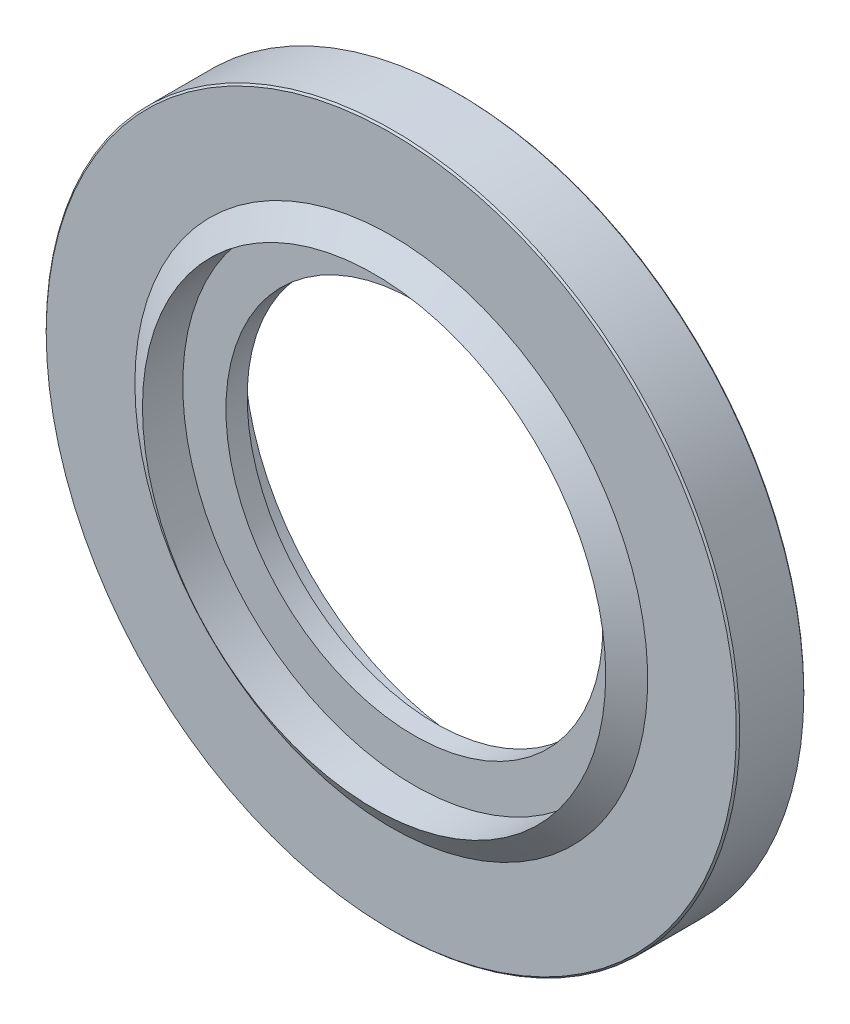
ISO-10303-21;
HEADER;
FILE_DESCRIPTION(('STEP AP214'),'2;1');
FILE_NAME('part.step','',(''),(''),'','','');
FILE_SCHEMA(('AUTOMOTIVE_DESIGN { 1 0 10303 214 1 1 1 1 }'));
ENDSEC;
DATA;
#1=APPLICATION_CONTEXT('core data for automotive mechanical design processes');
#2=APPLICATION_PROTOCOL_DEFINITION('international standard','automotive_design',2000,#1);
#3=PRODUCT_CONTEXT('',#1,'mechanical');
#4=PRODUCT('Part','Part','',(#3));
#5=PRODUCT_RELATED_PRODUCT_CATEGORY('part','',(#4));
#6=PRODUCT_DEFINITION_FORMATION('','',#4);
#7=PRODUCT_DEFINITION_CONTEXT('part definition',#1,'design');
#8=PRODUCT_DEFINITION('design','',#6,#7);
#9=PRODUCT_DEFINITION_SHAPE('','',#8);
#10=(LENGTH_UNIT() NAMED_UNIT(*) SI_UNIT(.MILLI.,.METRE.));
#11=(NAMED_UNIT(*) PLANE_ANGLE_UNIT() SI_UNIT($,.RADIAN.));
#12=(NAMED_UNIT(*) SI_UNIT($,.STERADIAN.) SOLID_ANGLE_UNIT());
#13=UNCERTAINTY_MEASURE_WITH_UNIT(LENGTH_MEASURE(1.E-05),#10,'distance_accuracy_value','');
#14=(GEOMETRIC_REPRESENTATION_CONTEXT(3) GLOBAL_UNCERTAINTY_ASSIGNED_CONTEXT((#13)) GLOBAL_UNIT_ASSIGNED_CONTEXT((#10,
#11,#12)) REPRESENTATION_CONTEXT('',''));
#15=CARTESIAN_POINT('',(0.,0.,0.));
#16=DIRECTION('',(0.,0.,1.));
#17=DIRECTION('',(1.,0.,0.));
#18=AXIS2_PLACEMENT_3D('',#15,#16,#17);
#19=CARTESIAN_POINT('',(0.,5.59,0.315));
#20=DIRECTION('',(0.,0.,-1.));
#21=DIRECTION('',(0.,-1.,0.));
#22=AXIS2_PLACEMENT_3D('',#19,#20,#21);
#23=PLANE('',#22);
#24=CARTESIAN_POINT('',(0.,0.,0.315));
#25=DIRECTION('',(0.,0.,1.));
#26=DIRECTION('',(1.,0.,0.));
#27=AXIS2_PLACEMENT_3D('',#24,#25,#26);
#28=CIRCLE('',#27,5.59);
#29=CARTESIAN_POINT('',(5.59,0.,0.315));
#30=VERTEX_POINT('',#29);
#31=EDGE_CURVE('E97',#30,#30,#28,.T.);
#32=ORIENTED_EDGE('',*,*,#31,.F.);
#33=EDGE_LOOP('',(#32));
#34=FACE_BOUND('',#33,.T.);
#35=CARTESIAN_POINT('',(0.,0.,0.315));
#36=DIRECTION('',(0.,0.,1.));
#37=DIRECTION('',(1.,0.,0.));
#38=AXIS2_PLACEMENT_3D('',#35,#36,#37);
#39=CIRCLE('',#38,6.87);
#40=CARTESIAN_POINT('',(6.87,0.,0.315));
#41=VERTEX_POINT('',#40);
#42=EDGE_CURVE('E19',#41,#41,#39,.T.);
#43=ORIENTED_EDGE('',*,*,#42,.T.);
#44=EDGE_LOOP('',(#43));
#45=FACE_BOUND('',#44,.T.);
#46=ADVANCED_FACE('F15',(#34,#45),#23,.F.);
#47=CARTESIAN_POINT('',(0.,5.59,-0.315));
#48=DIRECTION('',(0.,0.,1.));
#49=DIRECTION('',(1.,0.,0.));
#50=AXIS2_PLACEMENT_3D('',#47,#48,#49);
#51=PLANE('',#50);
#52=CARTESIAN_POINT('',(0.,0.,-0.315));
#53=DIRECTION('',(0.,0.,1.));
#54=DIRECTION('',(1.,0.,0.));
#55=AXIS2_PLACEMENT_3D('',#52,#53,#54);
#56=CIRCLE('',#55,5.59);
#57=CARTESIAN_POINT('',(5.59,0.,-0.315));
#58=VERTEX_POINT('',#57);
#59=EDGE_CURVE('E100',#58,#58,#56,.T.);
#60=ORIENTED_EDGE('',*,*,#59,.T.);
#61=EDGE_LOOP('',(#60));
#62=FACE_BOUND('',#61,.T.);
#63=CARTESIAN_POINT('',(0.,0.,-0.315));
#64=DIRECTION('',(0.,0.,1.));
#65=DIRECTION('',(1.,0.,0.));
#66=AXIS2_PLACEMENT_3D('',#63,#64,#65);
#67=CIRCLE('',#66,6.87);
#68=CARTESIAN_POINT('',(6.87,0.,-0.315));
#69=VERTEX_POINT('',#68);
#70=EDGE_CURVE('E86',#69,#69,#67,.T.);
#71=ORIENTED_EDGE('',*,*,#70,.F.);
#72=EDGE_LOOP('',(#71));
#73=FACE_BOUND('',#72,.T.);
#74=ADVANCED_FACE('F129',(#62,#73),#51,.F.);
#75=CARTESIAN_POINT('',(0.,10.285,1.));
#76=DIRECTION('',(0.,0.,-1.));
#77=DIRECTION('',(0.,-1.,0.));
#78=AXIS2_PLACEMENT_3D('',#75,#76,#77);
#79=PLANE('',#78);
#80=CARTESIAN_POINT('',(0.,0.,1.));
#81=DIRECTION('',(0.,0.,1.));
#82=DIRECTION('',(1.,0.,0.));
#83=AXIS2_PLACEMENT_3D('',#80,#81,#82);
#84=CIRCLE('',#83,7.605);
#85=CARTESIAN_POINT('',(-7.605,0.,1.));
#86=VERTEX_POINT('',#85);
#87=EDGE_CURVE('E90',#86,#86,#84,.T.);
#88=ORIENTED_EDGE('',*,*,#87,.F.);
#89=EDGE_LOOP('',(#88));
#90=FACE_BOUND('',#89,.T.);
#91=CARTESIAN_POINT('',(0.,0.,1.));
#92=DIRECTION('',(0.,0.,1.));
#93=DIRECTION('',(-1.,0.,0.));
#94=AXIS2_PLACEMENT_3D('',#91,#92,#93);
#95=CIRCLE('',#94,10.235);
#96=CARTESIAN_POINT('',(-10.235,0.,1.));
#97=VERTEX_POINT('',#96);
#98=EDGE_CURVE('E74',#97,#97,#95,.T.);
#99=ORIENTED_EDGE('',*,*,#98,.T.);
#100=EDGE_LOOP('',(#99));
#101=FACE_BOUND('',#100,.T.);
#102=ADVANCED_FACE('F75',(#90,#101),#79,.F.);
#103=CARTESIAN_POINT('',(0.,10.285,-1.));
#104=DIRECTION('',(0.,0.,1.));
#105=DIRECTION('',(1.,0.,0.));
#106=AXIS2_PLACEMENT_3D('',#103,#104,#105);
#107=PLANE('',#106);
#108=CARTESIAN_POINT('',(0.,0.,-1.));
#109=DIRECTION('',(0.,0.,1.));
#110=DIRECTION('',(1.,0.,0.));
#111=AXIS2_PLACEMENT_3D('',#108,#109,#110);
#112=CIRCLE('',#111,7.605);
#113=CARTESIAN_POINT('',(7.605,0.,-1.));
#114=VERTEX_POINT('',#113);
#115=EDGE_CURVE('E79',#114,#114,#112,.T.);
#116=ORIENTED_EDGE('',*,*,#115,.T.);
#117=EDGE_LOOP('',(#116));
#118=FACE_BOUND('',#117,.T.);
#119=CARTESIAN_POINT('',(0.,0.,-1.));
#120=DIRECTION('',(0.,0.,-1.));
#121=DIRECTION('',(1.,0.,0.));
#122=AXIS2_PLACEMENT_3D('',#119,#120,#121);
#123=CIRCLE('',#122,10.235);
#124=CARTESIAN_POINT('',(10.235,0.,-1.));
#125=VERTEX_POINT('',#124);
#126=EDGE_CURVE('E26',#125,#125,#123,.T.);
#127=ORIENTED_EDGE('',*,*,#126,.T.);
#128=EDGE_LOOP('',(#127));
#129=FACE_BOUND('',#128,.T.);
#130=ADVANCED_FACE('F138',(#118,#129),#107,.F.);
#131=CARTESIAN_POINT('',(0.,0.,5.91676702958475));
#132=DIRECTION('',(0.,0.,1.));
#133=DIRECTION('',(1.,0.,0.));
#134=AXIS2_PLACEMENT_3D('',#131,#132,#133);
#135=CYLINDRICAL_SURFACE('',#134,10.285);
#136=CARTESIAN_POINT('',(0.,0.,0.95));
#137=DIRECTION('',(0.,0.,-1.));
#138=DIRECTION('',(-1.,0.,0.));
#139=AXIS2_PLACEMENT_3D('',#136,#137,#138);
#140=CIRCLE('',#139,10.285);
#141=CARTESIAN_POINT('',(-10.285,0.,0.95));
#142=VERTEX_POINT('',#141);
#143=EDGE_CURVE('E78',#142,#142,#140,.T.);
#144=ORIENTED_EDGE('',*,*,#143,.T.);
#145=EDGE_LOOP('',(#144));
#146=FACE_BOUND('',#145,.T.);
#147=CARTESIAN_POINT('',(0.,0.,-0.95));
#148=DIRECTION('',(0.,0.,1.));
#149=DIRECTION('',(1.,0.,0.));
#150=AXIS2_PLACEMENT_3D('',#147,#148,#149);
#151=CIRCLE('',#150,10.285);
#152=CARTESIAN_POINT('',(10.285,0.,-0.95));
#153=VERTEX_POINT('',#152);
#154=EDGE_CURVE('E9',#153,#153,#151,.T.);
#155=ORIENTED_EDGE('',*,*,#154,.T.);
#156=EDGE_LOOP('',(#155));
#157=FACE_BOUND('',#156,.T.);
#158=ADVANCED_FACE('F141',(#146,#157),#135,.T.);
#159=CARTESIAN_POINT('',(0.,0.,-0.95));
#160=DIRECTION('',(0.,0.,1.));
#161=DIRECTION('',(1.,0.,0.));
#162=AXIS2_PLACEMENT_3D('',#159,#160,#161);
#163=CONICAL_SURFACE('',#162,10.285,0.785398163397414);
#164=ORIENTED_EDGE('',*,*,#154,.F.);
#165=EDGE_LOOP('',(#164));
#166=FACE_BOUND('',#165,.T.);
#167=ORIENTED_EDGE('',*,*,#126,.F.);
#168=EDGE_LOOP('',(#167));
#169=FACE_BOUND('',#168,.T.);
#170=ADVANCED_FACE('F190',(#166,#169),#163,.T.);
#171=CARTESIAN_POINT('',(0.,0.,1.));
#172=DIRECTION('',(0.,0.,-1.));
#173=DIRECTION('',(-1.,0.,0.));
#174=AXIS2_PLACEMENT_3D('',#171,#172,#173);
#175=CONICAL_SURFACE('',#174,10.235,0.785398163397448);
#176=ORIENTED_EDGE('',*,*,#143,.F.);
#177=EDGE_LOOP('',(#176));
#178=FACE_BOUND('',#177,.T.);
#179=ORIENTED_EDGE('',*,*,#98,.F.);
#180=EDGE_LOOP('',(#179));
#181=FACE_BOUND('',#180,.T.);
#182=ADVANCED_FACE('F17',(#178,#181),#175,.T.);
#183=CARTESIAN_POINT('',(0.,0.,-1.51));
#184=DIRECTION('',(0.,0.,1.));
#185=DIRECTION('',(1.,0.,0.));
#186=AXIS2_PLACEMENT_3D('',#183,#184,#185);
#187=CONICAL_SURFACE('',#186,6.87,0.964191218200371);
#188=ORIENTED_EDGE('',*,*,#115,.F.);
#189=EDGE_LOOP('',(#188));
#190=FACE_BOUND('',#189,.T.);
#191=CARTESIAN_POINT('',(0.,0.,-1.51));
#192=DIRECTION('',(0.,0.,1.));
#193=DIRECTION('',(1.,0.,0.));
#194=AXIS2_PLACEMENT_3D('',#191,#192,#193);
#195=CIRCLE('',#194,6.87);
#196=CARTESIAN_POINT('',(6.87,0.,-1.51));
#197=VERTEX_POINT('',#196);
#198=EDGE_CURVE('E96',#197,#197,#195,.T.);
#199=ORIENTED_EDGE('',*,*,#198,.T.);
#200=EDGE_LOOP('',(#199));
#201=FACE_BOUND('',#200,.T.);
#202=ADVANCED_FACE('F109',(#190,#201),#187,.T.);
#203=CARTESIAN_POINT('',(0.,0.,3.09554020225257));
#204=DIRECTION('',(0.,0.,1.));
#205=DIRECTION('',(1.,0.,0.));
#206=AXIS2_PLACEMENT_3D('',#203,#204,#205);
#207=CYLINDRICAL_SURFACE('',#206,6.87);
#208=ORIENTED_EDGE('',*,*,#70,.T.);
#209=EDGE_LOOP('',(#208));
#210=FACE_BOUND('',#209,.T.);
#211=ORIENTED_EDGE('',*,*,#198,.F.);
#212=EDGE_LOOP('',(#211));
#213=FACE_BOUND('',#212,.T.);
#214=ADVANCED_FACE('F111',(#210,#213),#207,.F.);
#215=CARTESIAN_POINT('',(0.,0.,3.09554020225257));
#216=DIRECTION('',(0.,0.,1.));
#217=DIRECTION('',(1.,0.,0.));
#218=AXIS2_PLACEMENT_3D('',#215,#216,#217);
#219=CYLINDRICAL_SURFACE('',#218,5.59);
#220=ORIENTED_EDGE('',*,*,#31,.T.);
#221=EDGE_LOOP('',(#220));
#222=FACE_BOUND('',#221,.T.);
#223=ORIENTED_EDGE('',*,*,#59,.F.);
#224=EDGE_LOOP('',(#223));
#225=FACE_BOUND('',#224,.T.);
#226=ADVANCED_FACE('F113',(#222,#225),#219,.F.);
#227=CARTESIAN_POINT('',(0.,0.,3.09554020225257));
#228=DIRECTION('',(0.,0.,1.));
#229=DIRECTION('',(1.,0.,0.));
#230=AXIS2_PLACEMENT_3D('',#227,#228,#229);
#231=CYLINDRICAL_SURFACE('',#230,6.87);
#232=CARTESIAN_POINT('',(0.,0.,1.51));
#233=DIRECTION('',(0.,0.,1.));
#234=DIRECTION('',(1.,0.,0.));
#235=AXIS2_PLACEMENT_3D('',#232,#233,#234);
#236=CIRCLE('',#235,6.87);
#237=CARTESIAN_POINT('',(-6.87,0.,1.51));
#238=VERTEX_POINT('',#237);
#239=EDGE_CURVE('E93',#238,#238,#236,.T.);
#240=ORIENTED_EDGE('',*,*,#239,.T.);
#241=EDGE_LOOP('',(#240));
#242=FACE_BOUND('',#241,.T.);
#243=ORIENTED_EDGE('',*,*,#42,.F.);
#244=EDGE_LOOP('',(#243));
#245=FACE_BOUND('',#244,.T.);
#246=ADVANCED_FACE('F121',(#242,#245),#231,.F.);
#247=CARTESIAN_POINT('',(0.,0.,1.));
#248=DIRECTION('',(0.,0.,-1.));
#249=DIRECTION('',(-1.,0.,0.));
#250=AXIS2_PLACEMENT_3D('',#247,#248,#249);
#251=CONICAL_SURFACE('',#250,7.605,0.96419121820037);
#252=ORIENTED_EDGE('',*,*,#87,.T.);
#253=EDGE_LOOP('',(#252));
#254=FACE_BOUND('',#253,.T.);
#255=ORIENTED_EDGE('',*,*,#239,.F.);
#256=EDGE_LOOP('',(#255));
#257=FACE_BOUND('',#256,.T.);
#258=ADVANCED_FACE('F143',(#254,#257),#251,.T.);
#259=CLOSED_SHELL('',(#46,#74,#102,#130,#158,#170,#182,#202,#214,#226,#246,#258));
#260=MANIFOLD_SOLID_BREP('B1',#259);
#261=ADVANCED_BREP_SHAPE_REPRESENTATION('',(#18,#260),#14);
#262=SHAPE_DEFINITION_REPRESENTATION(#9,#261);
ENDSEC;
END-ISO-10303-21;
